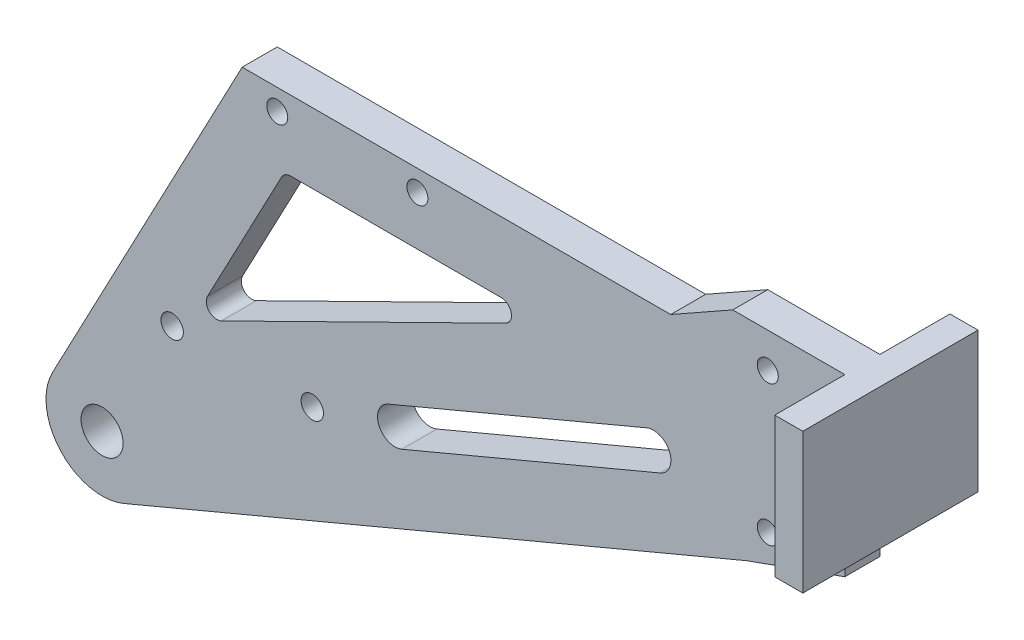
ISO-10303-21;
HEADER;
FILE_DESCRIPTION(('STEP AP214'),'2;1');
FILE_NAME('part.step','',(''),(''),'','','');
FILE_SCHEMA(('AUTOMOTIVE_DESIGN { 1 0 10303 214 1 1 1 1 }'));
ENDSEC;
DATA;
#1=APPLICATION_CONTEXT('core data for automotive mechanical design processes');
#2=APPLICATION_PROTOCOL_DEFINITION('international standard','automotive_design',2000,#1);
#3=PRODUCT_CONTEXT('',#1,'mechanical');
#4=PRODUCT('Part','Part','',(#3));
#5=PRODUCT_RELATED_PRODUCT_CATEGORY('part','',(#4));
#6=PRODUCT_DEFINITION_FORMATION('','',#4);
#7=PRODUCT_DEFINITION_CONTEXT('part definition',#1,'design');
#8=PRODUCT_DEFINITION('design','',#6,#7);
#9=PRODUCT_DEFINITION_SHAPE('','',#8);
#10=(LENGTH_UNIT() NAMED_UNIT(*) SI_UNIT(.MILLI.,.METRE.));
#11=(NAMED_UNIT(*) PLANE_ANGLE_UNIT() SI_UNIT($,.RADIAN.));
#12=(NAMED_UNIT(*) SI_UNIT($,.STERADIAN.) SOLID_ANGLE_UNIT());
#13=UNCERTAINTY_MEASURE_WITH_UNIT(LENGTH_MEASURE(1.E-05),#10,'distance_accuracy_value','');
#14=(GEOMETRIC_REPRESENTATION_CONTEXT(3) GLOBAL_UNCERTAINTY_ASSIGNED_CONTEXT((#13)) GLOBAL_UNIT_ASSIGNED_CONTEXT((#10,
#11,#12)) REPRESENTATION_CONTEXT('',''));
#15=CARTESIAN_POINT('',(0.,0.,0.));
#16=DIRECTION('',(0.,0.,1.));
#17=DIRECTION('',(1.,0.,0.));
#18=AXIS2_PLACEMENT_3D('',#15,#16,#17);
#19=CARTESIAN_POINT('',(0.,0.,5.));
#20=DIRECTION('',(0.,0.,1.));
#21=DIRECTION('',(1.,0.,0.));
#22=AXIS2_PLACEMENT_3D('',#19,#20,#21);
#23=PLANE('',#22);
#24=DIRECTION('',(0.921845226411098,0.387558226003619,0.));
#25=VECTOR('',#24,1.);
#26=CARTESIAN_POINT('',(-0.422501708110136,1.00496172352752,5.));
#27=LINE('',#26,#25);
#28=CARTESIAN_POINT('',(42.7745902769905,19.1656983185825,5.));
#29=VERTEX_POINT('',#28);
#30=CARTESIAN_POINT('',(79.6483993334344,34.6680273587272,5.));
#31=VERTEX_POINT('',#30);
#32=EDGE_CURVE('E58',#29,#31,#27,.T.);
#33=ORIENTED_EDGE('',*,*,#32,.F.);
#34=CARTESIAN_POINT('',(41.8056947119814,21.4703113846102,5.));
#35=DIRECTION('',(0.,0.,1.));
#36=DIRECTION('',(1.,0.,0.));
#37=AXIS2_PLACEMENT_3D('',#34,#35,#36);
#38=CIRCLE('',#37,2.5);
#39=CARTESIAN_POINT('',(40.8367991469724,23.774924450638,5.));
#40=VERTEX_POINT('',#39);
#41=EDGE_CURVE('E403',#40,#29,#38,.T.);
#42=ORIENTED_EDGE('',*,*,#41,.F.);
#43=DIRECTION('',(0.921845226411098,0.387558226003619,0.));
#44=VECTOR('',#43,1.);
#45=CARTESIAN_POINT('',(-2.36029283812824,5.61418785558302,5.));
#46=LINE('',#45,#44);
#47=CARTESIAN_POINT('',(77.7106082034163,39.2772534907827,5.));
#48=VERTEX_POINT('',#47);
#49=EDGE_CURVE('E393',#40,#48,#46,.T.);
#50=ORIENTED_EDGE('',*,*,#49,.T.);
#51=CARTESIAN_POINT('',(78.6795037684253,36.972640424755,5.));
#52=DIRECTION('',(0.,0.,1.));
#53=DIRECTION('',(1.,0.,0.));
#54=AXIS2_PLACEMENT_3D('',#51,#52,#53);
#55=CIRCLE('',#54,2.5);
#56=EDGE_CURVE('E898',#31,#48,#55,.T.);
#57=ORIENTED_EDGE('',*,*,#56,.F.);
#58=EDGE_LOOP('',(#33,#42,#50,#57));
#59=FACE_BOUND('',#58,.T.);
#60=CARTESIAN_POINT('',(10.,18.,5.));
#61=DIRECTION('',(0.,0.,1.));
#62=DIRECTION('',(1.,0.,0.));
#63=AXIS2_PLACEMENT_3D('',#60,#61,#62);
#64=CIRCLE('',#63,1.6);
#65=CARTESIAN_POINT('',(11.6,18.,5.));
#66=VERTEX_POINT('',#65);
#67=EDGE_CURVE('E243',#66,#66,#64,.T.);
#68=ORIENTED_EDGE('',*,*,#67,.F.);
#69=EDGE_LOOP('',(#68));
#70=FACE_BOUND('',#69,.T.);
#71=CARTESIAN_POINT('',(30.,18.,5.));
#72=DIRECTION('',(0.,0.,1.));
#73=DIRECTION('',(1.,0.,0.));
#74=AXIS2_PLACEMENT_3D('',#71,#72,#73);
#75=CIRCLE('',#74,1.6);
#76=CARTESIAN_POINT('',(31.6,18.,5.));
#77=VERTEX_POINT('',#76);
#78=EDGE_CURVE('E238',#77,#77,#75,.T.);
#79=ORIENTED_EDGE('',*,*,#78,.F.);
#80=EDGE_LOOP('',(#79));
#81=FACE_BOUND('',#80,.T.);
#82=CARTESIAN_POINT('',(56.9317860296705,43.5,5.));
#83=DIRECTION('',(0.,0.,1.));
#84=DIRECTION('',(1.,0.,0.));
#85=AXIS2_PLACEMENT_3D('',#82,#83,#84);
#86=CIRCLE('',#85,1.50000000000001);
#87=CARTESIAN_POINT('',(57.5951320607567,42.1546479854543,5.));
#88=VERTEX_POINT('',#87);
#89=CARTESIAN_POINT('',(56.9317860296705,45.,5.));
#90=VERTEX_POINT('',#89);
#91=EDGE_CURVE('E242',#88,#90,#86,.T.);
#92=ORIENTED_EDGE('',*,*,#91,.F.);
#93=DIRECTION('',(0.896901343030464,0.442230687390812,0.));
#94=VECTOR('',#93,1.);
#95=CARTESIAN_POINT('',(17.0325312009098,22.1546479854543,5.));
#96=LINE('',#95,#94);
#97=CARTESIAN_POINT('',(17.0325312009098,22.1546479854543,5.));
#98=VERTEX_POINT('',#97);
#99=EDGE_CURVE('E255',#98,#88,#96,.T.);
#100=ORIENTED_EDGE('',*,*,#99,.F.);
#101=CARTESIAN_POINT('',(16.3691851698236,23.5,5.));
#102=DIRECTION('',(0.,0.,1.));
#103=DIRECTION('',(1.,0.,0.));
#104=AXIS2_PLACEMENT_3D('',#101,#102,#103);
#105=CIRCLE('',#104,1.5);
#106=CARTESIAN_POINT('',(15.0428009644484,24.2005033474091,5.));
#107=VERTEX_POINT('',#106);
#108=EDGE_CURVE('E281',#107,#98,#105,.T.);
#109=ORIENTED_EDGE('',*,*,#108,.F.);
#110=DIRECTION('',(-0.46700223160609,-0.884256136916748,0.));
#111=VECTOR('',#110,1.);
#112=CARTESIAN_POINT('',(25.6054018242954,44.2005033474091,5.));
#113=LINE('',#112,#111);
#114=CARTESIAN_POINT('',(25.6054018242954,44.2005033474091,5.));
#115=VERTEX_POINT('',#114);
#116=EDGE_CURVE('E278',#115,#107,#113,.T.);
#117=ORIENTED_EDGE('',*,*,#116,.F.);
#118=CARTESIAN_POINT('',(26.9317860296705,43.5,5.));
#119=DIRECTION('',(0.,0.,1.));
#120=DIRECTION('',(-1.,0.,0.));
#121=AXIS2_PLACEMENT_3D('',#118,#119,#120);
#122=CIRCLE('',#121,1.5);
#123=CARTESIAN_POINT('',(26.9317860296705,45.,5.));
#124=VERTEX_POINT('',#123);
#125=EDGE_CURVE('E275',#124,#115,#122,.T.);
#126=ORIENTED_EDGE('',*,*,#125,.F.);
#127=DIRECTION('',(-1.,0.,0.));
#128=VECTOR('',#127,1.);
#129=CARTESIAN_POINT('',(56.9317860296705,45.,5.));
#130=LINE('',#129,#128);
#131=EDGE_CURVE('E272',#90,#124,#130,.T.);
#132=ORIENTED_EDGE('',*,*,#131,.F.);
#133=EDGE_LOOP('',(#92,#100,#109,#117,#126,#132));
#134=FACE_BOUND('',#133,.T.);
#135=CARTESIAN_POINT('',(25.,52.,5.));
#136=DIRECTION('',(0.,0.,1.));
#137=DIRECTION('',(1.,0.,0.));
#138=AXIS2_PLACEMENT_3D('',#135,#136,#137);
#139=CIRCLE('',#138,1.5);
#140=CARTESIAN_POINT('',(26.5,52.,5.));
#141=VERTEX_POINT('',#140);
#142=EDGE_CURVE('E310',#141,#141,#139,.T.);
#143=ORIENTED_EDGE('',*,*,#142,.F.);
#144=EDGE_LOOP('',(#143));
#145=FACE_BOUND('',#144,.T.);
#146=CARTESIAN_POINT('',(45.,52.,5.));
#147=DIRECTION('',(0.,0.,1.));
#148=DIRECTION('',(1.,0.,0.));
#149=AXIS2_PLACEMENT_3D('',#146,#147,#148);
#150=CIRCLE('',#149,1.5);
#151=CARTESIAN_POINT('',(46.5,52.,5.));
#152=VERTEX_POINT('',#151);
#153=EDGE_CURVE('E301',#152,#152,#150,.T.);
#154=ORIENTED_EDGE('',*,*,#153,.F.);
#155=EDGE_LOOP('',(#154));
#156=FACE_BOUND('',#155,.T.);
#157=CARTESIAN_POINT('',(0.,0.,5.));
#158=DIRECTION('',(0.,0.,1.));
#159=DIRECTION('',(1.,0.,0.));
#160=AXIS2_PLACEMENT_3D('',#157,#158,#159);
#161=CIRCLE('',#160,3.);
#162=CARTESIAN_POINT('',(3.,0.,5.));
#163=VERTEX_POINT('',#162);
#164=EDGE_CURVE('E341',#163,#163,#161,.T.);
#165=ORIENTED_EDGE('',*,*,#164,.F.);
#166=EDGE_LOOP('',(#165));
#167=FACE_BOUND('',#166,.T.);
#168=CARTESIAN_POINT('',(95.,55.,5.));
#169=DIRECTION('',(0.,0.,1.));
#170=DIRECTION('',(1.,0.,0.));
#171=AXIS2_PLACEMENT_3D('',#168,#169,#170);
#172=CIRCLE('',#171,1.5);
#173=CARTESIAN_POINT('',(96.5,55.,5.));
#174=VERTEX_POINT('',#173);
#175=EDGE_CURVE('E335',#174,#174,#172,.T.);
#176=ORIENTED_EDGE('',*,*,#175,.F.);
#177=EDGE_LOOP('',(#176));
#178=FACE_BOUND('',#177,.T.);
#179=CARTESIAN_POINT('',(95.,35.,5.));
#180=DIRECTION('',(0.,0.,1.));
#181=DIRECTION('',(1.,0.,0.));
#182=AXIS2_PLACEMENT_3D('',#179,#180,#181);
#183=CIRCLE('',#182,1.5);
#184=CARTESIAN_POINT('',(96.5,35.,5.));
#185=VERTEX_POINT('',#184);
#186=EDGE_CURVE('E329',#185,#185,#183,.T.);
#187=ORIENTED_EDGE('',*,*,#186,.F.);
#188=EDGE_LOOP('',(#187));
#189=FACE_BOUND('',#188,.T.);
#190=DIRECTION('',(0.921845226411098,0.387558226003619,0.));
#191=VECTOR('',#190,1.);
#192=CARTESIAN_POINT('',(92.,30.,5.));
#193=LINE('',#192,#191);
#194=CARTESIAN_POINT('',(3.10046580802895,-7.37476181128878,5.));
#195=VERTEX_POINT('',#194);
#196=CARTESIAN_POINT('',(92.,30.,5.));
#197=VERTEX_POINT('',#196);
#198=EDGE_CURVE('E349',#195,#197,#193,.T.);
#199=ORIENTED_EDGE('',*,*,#198,.T.);
#200=DIRECTION('',(0.941401777857667,0.337287255386894,0.));
#201=VECTOR('',#200,1.);
#202=CARTESIAN_POINT('',(0.940483067372337,-2.62498039142855,5.));
#203=LINE('',#202,#201);
#204=CARTESIAN_POINT('',(106.,35.0159471614366,5.));
#205=VERTEX_POINT('',#204);
#206=EDGE_CURVE('E396',#197,#205,#203,.T.);
#207=ORIENTED_EDGE('',*,*,#206,.T.);
#208=DIRECTION('',(0.,-1.,0.));
#209=VECTOR('',#208,1.);
#210=CARTESIAN_POINT('',(106.,0.,5.));
#211=LINE('',#210,#209);
#212=CARTESIAN_POINT('',(106.,40.,5.));
#213=VERTEX_POINT('',#212);
#214=EDGE_CURVE('E439',#213,#205,#211,.T.);
#215=ORIENTED_EDGE('',*,*,#214,.F.);
#216=DIRECTION('',(0.,-1.,0.));
#217=VECTOR('',#216,1.);
#218=CARTESIAN_POINT('',(106.,0.,5.));
#219=LINE('',#218,#217);
#220=CARTESIAN_POINT('',(106.,60.,5.));
#221=VERTEX_POINT('',#220);
#222=EDGE_CURVE('E235',#221,#213,#219,.T.);
#223=ORIENTED_EDGE('',*,*,#222,.F.);
#224=DIRECTION('',(-1.,0.,0.));
#225=VECTOR('',#224,1.);
#226=CARTESIAN_POINT('',(90.,60.,5.));
#227=LINE('',#226,#225);
#228=CARTESIAN_POINT('',(90.,60.,5.));
#229=VERTEX_POINT('',#228);
#230=EDGE_CURVE('E353',#221,#229,#227,.T.);
#231=ORIENTED_EDGE('',*,*,#230,.T.);
#232=DIRECTION('',(-0.870797121650983,-0.4916425255451,0.));
#233=VECTOR('',#232,1.);
#234=CARTESIAN_POINT('',(-3.9331402043608,6.96637697320786,5.));
#235=LINE('',#234,#233);
#236=CARTESIAN_POINT('',(81.1440012162749,55.,5.));
#237=VERTEX_POINT('',#236);
#238=EDGE_CURVE('E355',#229,#237,#235,.T.);
#239=ORIENTED_EDGE('',*,*,#238,.T.);
#240=DIRECTION('',(-1.,0.,0.));
#241=VECTOR('',#240,1.);
#242=CARTESIAN_POINT('',(81.1440012162749,55.,5.));
#243=LINE('',#242,#241);
#244=CARTESIAN_POINT('',(20.,55.,5.));
#245=VERTEX_POINT('',#244);
#246=EDGE_CURVE('E309',#237,#245,#243,.T.);
#247=ORIENTED_EDGE('',*,*,#246,.T.);
#248=DIRECTION('',(-0.46700223160609,-0.884256136916748,0.));
#249=VECTOR('',#248,1.);
#250=CARTESIAN_POINT('',(-7.07404909533399,3.73601785284872,5.));
#251=LINE('',#250,#249);
#252=CARTESIAN_POINT('',(-7.07404909533399,3.73601785284872,5.));
#253=VERTEX_POINT('',#252);
#254=EDGE_CURVE('E288',#245,#253,#251,.T.);
#255=ORIENTED_EDGE('',*,*,#254,.T.);
#256=CARTESIAN_POINT('',(0.,0.,5.));
#257=DIRECTION('',(0.,0.,1.));
#258=DIRECTION('',(1.,0.,0.));
#259=AXIS2_PLACEMENT_3D('',#256,#257,#258);
#260=CIRCLE('',#259,8.);
#261=EDGE_CURVE('E347',#253,#195,#260,.T.);
#262=ORIENTED_EDGE('',*,*,#261,.T.);
#263=EDGE_LOOP('',(#199,#207,#215,#223,#231,#239,#247,#255,#262));
#264=FACE_BOUND('',#263,.T.);
#265=ADVANCED_FACE('F43',(#59,#70,#81,#134,#145,#156,#167,#178,#189,#264),#23,.T.);
#266=CARTESIAN_POINT('',(0.,0.,0.));
#267=DIRECTION('',(0.,0.,1.));
#268=DIRECTION('',(1.,0.,0.));
#269=AXIS2_PLACEMENT_3D('',#266,#267,#268);
#270=PLANE('',#269);
#271=CARTESIAN_POINT('',(41.8056947119814,21.4703113846102,0.));
#272=DIRECTION('',(0.,0.,1.));
#273=DIRECTION('',(1.,0.,0.));
#274=AXIS2_PLACEMENT_3D('',#271,#272,#273);
#275=CIRCLE('',#274,2.5);
#276=CARTESIAN_POINT('',(40.8367991469724,23.774924450638,0.));
#277=VERTEX_POINT('',#276);
#278=CARTESIAN_POINT('',(42.7745902769905,19.1656983185825,0.));
#279=VERTEX_POINT('',#278);
#280=EDGE_CURVE('E51',#277,#279,#275,.T.);
#281=ORIENTED_EDGE('',*,*,#280,.T.);
#282=DIRECTION('',(0.921845226411098,0.387558226003619,0.));
#283=VECTOR('',#282,1.);
#284=CARTESIAN_POINT('',(-0.422501708110136,1.00496172352752,0.));
#285=LINE('',#284,#283);
#286=CARTESIAN_POINT('',(79.6483993334344,34.6680273587272,0.));
#287=VERTEX_POINT('',#286);
#288=EDGE_CURVE('E11',#279,#287,#285,.T.);
#289=ORIENTED_EDGE('',*,*,#288,.T.);
#290=CARTESIAN_POINT('',(78.6795037684253,36.972640424755,0.));
#291=DIRECTION('',(0.,0.,1.));
#292=DIRECTION('',(1.,0.,0.));
#293=AXIS2_PLACEMENT_3D('',#290,#291,#292);
#294=CIRCLE('',#293,2.5);
#295=CARTESIAN_POINT('',(77.7106082034163,39.2772534907827,0.));
#296=VERTEX_POINT('',#295);
#297=EDGE_CURVE('E373',#287,#296,#294,.T.);
#298=ORIENTED_EDGE('',*,*,#297,.T.);
#299=DIRECTION('',(0.921845226411098,0.387558226003619,0.));
#300=VECTOR('',#299,1.);
#301=CARTESIAN_POINT('',(-2.36029283812824,5.61418785558302,0.));
#302=LINE('',#301,#300);
#303=EDGE_CURVE('E376',#277,#296,#302,.T.);
#304=ORIENTED_EDGE('',*,*,#303,.F.);
#305=EDGE_LOOP('',(#281,#289,#298,#304));
#306=FACE_BOUND('',#305,.T.);
#307=CARTESIAN_POINT('',(95.,35.,0.));
#308=DIRECTION('',(0.,0.,1.));
#309=DIRECTION('',(1.,0.,0.));
#310=AXIS2_PLACEMENT_3D('',#307,#308,#309);
#311=CIRCLE('',#310,1.5);
#312=CARTESIAN_POINT('',(96.5,35.,0.));
#313=VERTEX_POINT('',#312);
#314=EDGE_CURVE('E328',#313,#313,#311,.T.);
#315=ORIENTED_EDGE('',*,*,#314,.T.);
#316=EDGE_LOOP('',(#315));
#317=FACE_BOUND('',#316,.T.);
#318=CARTESIAN_POINT('',(95.,55.,0.));
#319=DIRECTION('',(0.,0.,1.));
#320=DIRECTION('',(1.,0.,0.));
#321=AXIS2_PLACEMENT_3D('',#318,#319,#320);
#322=CIRCLE('',#321,1.5);
#323=CARTESIAN_POINT('',(96.5,55.,0.));
#324=VERTEX_POINT('',#323);
#325=EDGE_CURVE('E332',#324,#324,#322,.T.);
#326=ORIENTED_EDGE('',*,*,#325,.T.);
#327=EDGE_LOOP('',(#326));
#328=FACE_BOUND('',#327,.T.);
#329=CARTESIAN_POINT('',(0.,0.,0.));
#330=DIRECTION('',(0.,0.,1.));
#331=DIRECTION('',(1.,0.,0.));
#332=AXIS2_PLACEMENT_3D('',#329,#330,#331);
#333=CIRCLE('',#332,3.);
#334=CARTESIAN_POINT('',(3.,0.,0.));
#335=VERTEX_POINT('',#334);
#336=EDGE_CURVE('E338',#335,#335,#333,.T.);
#337=ORIENTED_EDGE('',*,*,#336,.T.);
#338=EDGE_LOOP('',(#337));
#339=FACE_BOUND('',#338,.T.);
#340=CARTESIAN_POINT('',(45.,52.,0.));
#341=DIRECTION('',(0.,0.,1.));
#342=DIRECTION('',(1.,0.,0.));
#343=AXIS2_PLACEMENT_3D('',#340,#341,#342);
#344=CIRCLE('',#343,1.5);
#345=CARTESIAN_POINT('',(46.5,52.,0.));
#346=VERTEX_POINT('',#345);
#347=EDGE_CURVE('E313',#346,#346,#344,.T.);
#348=ORIENTED_EDGE('',*,*,#347,.T.);
#349=EDGE_LOOP('',(#348));
#350=FACE_BOUND('',#349,.T.);
#351=CARTESIAN_POINT('',(25.,52.,0.));
#352=DIRECTION('',(0.,0.,1.));
#353=DIRECTION('',(1.,0.,0.));
#354=AXIS2_PLACEMENT_3D('',#351,#352,#353);
#355=CIRCLE('',#354,1.5);
#356=CARTESIAN_POINT('',(26.5,52.,0.));
#357=VERTEX_POINT('',#356);
#358=EDGE_CURVE('E306',#357,#357,#355,.T.);
#359=ORIENTED_EDGE('',*,*,#358,.T.);
#360=EDGE_LOOP('',(#359));
#361=FACE_BOUND('',#360,.T.);
#362=DIRECTION('',(0.896901343030464,0.442230687390812,0.));
#363=VECTOR('',#362,1.);
#364=CARTESIAN_POINT('',(17.0325312009098,22.1546479854543,0.));
#365=LINE('',#364,#363);
#366=CARTESIAN_POINT('',(17.0325312009098,22.1546479854543,0.));
#367=VERTEX_POINT('',#366);
#368=CARTESIAN_POINT('',(57.5951320607567,42.1546479854543,0.));
#369=VERTEX_POINT('',#368);
#370=EDGE_CURVE('E267',#367,#369,#365,.T.);
#371=ORIENTED_EDGE('',*,*,#370,.T.);
#372=CARTESIAN_POINT('',(56.9317860296705,43.5,0.));
#373=DIRECTION('',(0.,0.,1.));
#374=DIRECTION('',(1.,0.,0.));
#375=AXIS2_PLACEMENT_3D('',#372,#373,#374);
#376=CIRCLE('',#375,1.50000000000001);
#377=CARTESIAN_POINT('',(56.9317860296705,45.,0.));
#378=VERTEX_POINT('',#377);
#379=EDGE_CURVE('E251',#369,#378,#376,.T.);
#380=ORIENTED_EDGE('',*,*,#379,.T.);
#381=DIRECTION('',(-1.,0.,0.));
#382=VECTOR('',#381,1.);
#383=CARTESIAN_POINT('',(56.9317860296705,45.,0.));
#384=LINE('',#383,#382);
#385=CARTESIAN_POINT('',(26.9317860296705,45.,0.));
#386=VERTEX_POINT('',#385);
#387=EDGE_CURVE('E254',#378,#386,#384,.T.);
#388=ORIENTED_EDGE('',*,*,#387,.T.);
#389=CARTESIAN_POINT('',(26.9317860296705,43.5,0.));
#390=DIRECTION('',(0.,0.,1.));
#391=DIRECTION('',(-1.,0.,0.));
#392=AXIS2_PLACEMENT_3D('',#389,#390,#391);
#393=CIRCLE('',#392,1.5);
#394=CARTESIAN_POINT('',(25.6054018242954,44.2005033474091,0.));
#395=VERTEX_POINT('',#394);
#396=EDGE_CURVE('E258',#386,#395,#393,.T.);
#397=ORIENTED_EDGE('',*,*,#396,.T.);
#398=DIRECTION('',(-0.46700223160609,-0.884256136916748,0.));
#399=VECTOR('',#398,1.);
#400=CARTESIAN_POINT('',(25.6054018242954,44.2005033474091,0.));
#401=LINE('',#400,#399);
#402=CARTESIAN_POINT('',(15.0428009644484,24.2005033474091,0.));
#403=VERTEX_POINT('',#402);
#404=EDGE_CURVE('E261',#395,#403,#401,.T.);
#405=ORIENTED_EDGE('',*,*,#404,.T.);
#406=CARTESIAN_POINT('',(16.3691851698236,23.5,0.));
#407=DIRECTION('',(0.,0.,1.));
#408=DIRECTION('',(1.,0.,0.));
#409=AXIS2_PLACEMENT_3D('',#406,#407,#408);
#410=CIRCLE('',#409,1.5);
#411=EDGE_CURVE('E264',#403,#367,#410,.T.);
#412=ORIENTED_EDGE('',*,*,#411,.T.);
#413=EDGE_LOOP('',(#371,#380,#388,#397,#405,#412));
#414=FACE_BOUND('',#413,.T.);
#415=CARTESIAN_POINT('',(30.,18.,0.));
#416=DIRECTION('',(0.,0.,1.));
#417=DIRECTION('',(1.,0.,0.));
#418=AXIS2_PLACEMENT_3D('',#415,#416,#417);
#419=CIRCLE('',#418,1.6);
#420=CARTESIAN_POINT('',(31.6,18.,0.));
#421=VERTEX_POINT('',#420);
#422=EDGE_CURVE('E246',#421,#421,#419,.T.);
#423=ORIENTED_EDGE('',*,*,#422,.T.);
#424=EDGE_LOOP('',(#423));
#425=FACE_BOUND('',#424,.T.);
#426=CARTESIAN_POINT('',(10.,18.,0.));
#427=DIRECTION('',(0.,0.,1.));
#428=DIRECTION('',(1.,0.,0.));
#429=AXIS2_PLACEMENT_3D('',#426,#427,#428);
#430=CIRCLE('',#429,1.6);
#431=CARTESIAN_POINT('',(11.6,18.,0.));
#432=VERTEX_POINT('',#431);
#433=EDGE_CURVE('E239',#432,#432,#430,.T.);
#434=ORIENTED_EDGE('',*,*,#433,.T.);
#435=EDGE_LOOP('',(#434));
#436=FACE_BOUND('',#435,.T.);
#437=DIRECTION('',(0.941401777857667,0.337287255386894,0.));
#438=VECTOR('',#437,1.);
#439=CARTESIAN_POINT('',(0.940483067372337,-2.62498039142855,0.));
#440=LINE('',#439,#438);
#441=CARTESIAN_POINT('',(92.,30.,0.));
#442=VERTEX_POINT('',#441);
#443=CARTESIAN_POINT('',(106.,35.0159471614366,0.));
#444=VERTEX_POINT('',#443);
#445=EDGE_CURVE('E406',#442,#444,#440,.T.);
#446=ORIENTED_EDGE('',*,*,#445,.F.);
#447=DIRECTION('',(0.921845226411098,0.387558226003619,0.));
#448=VECTOR('',#447,1.);
#449=CARTESIAN_POINT('',(92.,30.,0.));
#450=LINE('',#449,#448);
#451=CARTESIAN_POINT('',(3.10046580802895,-7.37476181128878,0.));
#452=VERTEX_POINT('',#451);
#453=EDGE_CURVE('E360',#452,#442,#450,.T.);
#454=ORIENTED_EDGE('',*,*,#453,.F.);
#455=CARTESIAN_POINT('',(0.,0.,0.));
#456=DIRECTION('',(0.,0.,1.));
#457=DIRECTION('',(1.,0.,0.));
#458=AXIS2_PLACEMENT_3D('',#455,#456,#457);
#459=CIRCLE('',#458,8.);
#460=CARTESIAN_POINT('',(-7.07404909533399,3.73601785284872,0.));
#461=VERTEX_POINT('',#460);
#462=EDGE_CURVE('E344',#461,#452,#459,.T.);
#463=ORIENTED_EDGE('',*,*,#462,.F.);
#464=DIRECTION('',(0.46700223160609,0.884256136916749,0.));
#465=VECTOR('',#464,1.);
#466=CARTESIAN_POINT('',(-7.07404909533399,3.73601785284872,0.));
#467=LINE('',#466,#465);
#468=CARTESIAN_POINT('',(20.,55.,0.));
#469=VERTEX_POINT('',#468);
#470=EDGE_CURVE('E299',#461,#469,#467,.T.);
#471=ORIENTED_EDGE('',*,*,#470,.T.);
#472=DIRECTION('',(1.,0.,0.));
#473=VECTOR('',#472,1.);
#474=CARTESIAN_POINT('',(81.1440012162749,55.,0.));
#475=LINE('',#474,#473);
#476=CARTESIAN_POINT('',(81.1440012162749,55.,0.));
#477=VERTEX_POINT('',#476);
#478=EDGE_CURVE('E324',#469,#477,#475,.T.);
#479=ORIENTED_EDGE('',*,*,#478,.T.);
#480=DIRECTION('',(-0.870797121650983,-0.4916425255451,0.));
#481=VECTOR('',#480,1.);
#482=CARTESIAN_POINT('',(-3.9331402043608,6.96637697320786,0.));
#483=LINE('',#482,#481);
#484=CARTESIAN_POINT('',(90.,60.,0.));
#485=VERTEX_POINT('',#484);
#486=EDGE_CURVE('E350',#485,#477,#483,.T.);
#487=ORIENTED_EDGE('',*,*,#486,.F.);
#488=DIRECTION('',(-1.,0.,0.));
#489=VECTOR('',#488,1.);
#490=CARTESIAN_POINT('',(90.,60.,0.));
#491=LINE('',#490,#489);
#492=CARTESIAN_POINT('',(106.,60.,0.));
#493=VERTEX_POINT('',#492);
#494=EDGE_CURVE('E363',#493,#485,#491,.T.);
#495=ORIENTED_EDGE('',*,*,#494,.F.);
#496=DIRECTION('',(0.,-1.,0.));
#497=VECTOR('',#496,1.);
#498=CARTESIAN_POINT('',(106.,0.,0.));
#499=LINE('',#498,#497);
#500=CARTESIAN_POINT('',(106.,40.,0.));
#501=VERTEX_POINT('',#500);
#502=EDGE_CURVE('E227',#493,#501,#499,.T.);
#503=ORIENTED_EDGE('',*,*,#502,.T.);
#504=DIRECTION('',(0.,-1.,0.));
#505=VECTOR('',#504,1.);
#506=CARTESIAN_POINT('',(106.,0.,0.));
#507=LINE('',#506,#505);
#508=EDGE_CURVE('E436',#501,#444,#507,.T.);
#509=ORIENTED_EDGE('',*,*,#508,.T.);
#510=EDGE_LOOP('',(#446,#454,#463,#471,#479,#487,#495,#503,#509));
#511=FACE_BOUND('',#510,.T.);
#512=ADVANCED_FACE('F380',(#306,#317,#328,#339,#350,#361,#414,#425,#436,#511),#270,.F.);
#513=CARTESIAN_POINT('',(106.,60.,-10.));
#514=DIRECTION('',(0.,0.,-1.));
#515=DIRECTION('',(-1.,0.,0.));
#516=AXIS2_PLACEMENT_3D('',#513,#514,#515);
#517=PLANE('',#516);
#518=DIRECTION('',(-1.,0.,0.));
#519=VECTOR('',#518,1.);
#520=CARTESIAN_POINT('',(0.,40.,-10.));
#521=LINE('',#520,#519);
#522=CARTESIAN_POINT('',(110.,40.,-10.));
#523=VERTEX_POINT('',#522);
#524=CARTESIAN_POINT('',(106.,40.,-10.));
#525=VERTEX_POINT('',#524);
#526=EDGE_CURVE('E209',#523,#525,#521,.T.);
#527=ORIENTED_EDGE('',*,*,#526,.T.);
#528=DIRECTION('',(0.,1.,0.));
#529=VECTOR('',#528,1.);
#530=CARTESIAN_POINT('',(106.,60.,-10.));
#531=LINE('',#530,#529);
#532=CARTESIAN_POINT('',(106.,60.,-10.));
#533=VERTEX_POINT('',#532);
#534=EDGE_CURVE('E224',#525,#533,#531,.T.);
#535=ORIENTED_EDGE('',*,*,#534,.T.);
#536=DIRECTION('',(1.,0.,0.));
#537=VECTOR('',#536,1.);
#538=CARTESIAN_POINT('',(106.,60.,-10.));
#539=LINE('',#538,#537);
#540=CARTESIAN_POINT('',(110.,60.,-10.));
#541=VERTEX_POINT('',#540);
#542=EDGE_CURVE('E217',#533,#541,#539,.T.);
#543=ORIENTED_EDGE('',*,*,#542,.T.);
#544=DIRECTION('',(0.,-1.,0.));
#545=VECTOR('',#544,1.);
#546=CARTESIAN_POINT('',(110.,0.,-10.));
#547=LINE('',#546,#545);
#548=EDGE_CURVE('E198',#541,#523,#547,.T.);
#549=ORIENTED_EDGE('',*,*,#548,.T.);
#550=EDGE_LOOP('',(#527,#535,#543,#549));
#551=FACE_BOUND('',#550,.T.);
#552=ADVANCED_FACE('F222',(#551),#517,.T.);
#553=CARTESIAN_POINT('',(106.,0.,0.));
#554=DIRECTION('',(-1.,0.,0.));
#555=DIRECTION('',(0.,-1.,0.));
#556=AXIS2_PLACEMENT_3D('',#553,#554,#555);
#557=PLANE('',#556);
#558=DIRECTION('',(0.,0.,1.));
#559=VECTOR('',#558,1.);
#560=CARTESIAN_POINT('',(106.,40.,-10.));
#561=LINE('',#560,#559);
#562=EDGE_CURVE('E429',#525,#501,#561,.T.);
#563=ORIENTED_EDGE('',*,*,#562,.T.);
#564=ORIENTED_EDGE('',*,*,#502,.F.);
#565=DIRECTION('',(0.,0.,1.));
#566=VECTOR('',#565,1.);
#567=CARTESIAN_POINT('',(106.,60.,15.));
#568=LINE('',#567,#566);
#569=EDGE_CURVE('E230',#533,#493,#568,.T.);
#570=ORIENTED_EDGE('',*,*,#569,.F.);
#571=ORIENTED_EDGE('',*,*,#534,.F.);
#572=EDGE_LOOP('',(#563,#564,#570,#571));
#573=FACE_BOUND('',#572,.T.);
#574=ADVANCED_FACE('F444',(#573),#557,.T.);
#575=CARTESIAN_POINT('',(106.,30.,15.));
#576=DIRECTION('',(0.,0.,1.));
#577=DIRECTION('',(1.,0.,0.));
#578=AXIS2_PLACEMENT_3D('',#575,#576,#577);
#579=PLANE('',#578);
#580=DIRECTION('',(-1.,0.,0.));
#581=VECTOR('',#580,1.);
#582=CARTESIAN_POINT('',(0.,40.,15.));
#583=LINE('',#582,#581);
#584=CARTESIAN_POINT('',(110.,40.,15.));
#585=VERTEX_POINT('',#584);
#586=CARTESIAN_POINT('',(106.,40.,15.));
#587=VERTEX_POINT('',#586);
#588=EDGE_CURVE('E210',#585,#587,#583,.T.);
#589=ORIENTED_EDGE('',*,*,#588,.F.);
#590=DIRECTION('',(0.,-1.,0.));
#591=VECTOR('',#590,1.);
#592=CARTESIAN_POINT('',(110.,0.,15.));
#593=LINE('',#592,#591);
#594=CARTESIAN_POINT('',(110.,60.,15.));
#595=VERTEX_POINT('',#594);
#596=EDGE_CURVE('E420',#595,#585,#593,.T.);
#597=ORIENTED_EDGE('',*,*,#596,.F.);
#598=DIRECTION('',(1.,0.,0.));
#599=VECTOR('',#598,1.);
#600=CARTESIAN_POINT('',(106.,60.,15.));
#601=LINE('',#600,#599);
#602=CARTESIAN_POINT('',(106.,60.,15.));
#603=VERTEX_POINT('',#602);
#604=EDGE_CURVE('E220',#603,#595,#601,.T.);
#605=ORIENTED_EDGE('',*,*,#604,.F.);
#606=DIRECTION('',(0.,-1.,0.));
#607=VECTOR('',#606,1.);
#608=CARTESIAN_POINT('',(106.,30.,15.));
#609=LINE('',#608,#607);
#610=EDGE_CURVE('E225',#603,#587,#609,.T.);
#611=ORIENTED_EDGE('',*,*,#610,.T.);
#612=EDGE_LOOP('',(#589,#597,#605,#611));
#613=FACE_BOUND('',#612,.T.);
#614=ADVANCED_FACE('F419',(#613),#579,.T.);
#615=EDGE_CURVE('E423',#213,#587,#561,.T.);
#616=ORIENTED_EDGE('',*,*,#615,.T.);
#617=ORIENTED_EDGE('',*,*,#610,.F.);
#618=EDGE_CURVE('E410',#221,#603,#568,.T.);
#619=ORIENTED_EDGE('',*,*,#618,.F.);
#620=ORIENTED_EDGE('',*,*,#222,.T.);
#621=EDGE_LOOP('',(#616,#617,#619,#620));
#622=FACE_BOUND('',#621,.T.);
#623=ADVANCED_FACE('F422',(#622),#557,.T.);
#624=CARTESIAN_POINT('',(0.,0.,5.));
#625=DIRECTION('',(0.,0.,-1.));
#626=DIRECTION('',(-1.,0.,0.));
#627=AXIS2_PLACEMENT_3D('',#624,#625,#626);
#628=CYLINDRICAL_SURFACE('',#627,8.);
#629=ORIENTED_EDGE('',*,*,#261,.F.);
#630=DIRECTION('',(0.,0.,1.));
#631=VECTOR('',#630,1.);
#632=CARTESIAN_POINT('',(-7.07404909533399,3.73601785284872,-57.974132162543));
#633=LINE('',#632,#631);
#634=EDGE_CURVE('E302',#461,#253,#633,.T.);
#635=ORIENTED_EDGE('',*,*,#634,.F.);
#636=ORIENTED_EDGE('',*,*,#462,.T.);
#637=DIRECTION('',(0.,0.,-1.));
#638=VECTOR('',#637,1.);
#639=CARTESIAN_POINT('',(3.10046580802895,-7.37476181128878,5.));
#640=LINE('',#639,#638);
#641=EDGE_CURVE('E370',#195,#452,#640,.T.);
#642=ORIENTED_EDGE('',*,*,#641,.F.);
#643=EDGE_LOOP('',(#629,#635,#636,#642));
#644=FACE_BOUND('',#643,.T.);
#645=ADVANCED_FACE('F45',(#644),#628,.T.);
#646=CARTESIAN_POINT('',(92.,30.,5.));
#647=DIRECTION('',(-0.387558226003619,0.921845226411098,0.));
#648=DIRECTION('',(-0.921845226411098,-0.387558226003619,0.));
#649=AXIS2_PLACEMENT_3D('',#646,#647,#648);
#650=PLANE('',#649);
#651=ORIENTED_EDGE('',*,*,#453,.T.);
#652=DIRECTION('',(0.,0.,-1.));
#653=VECTOR('',#652,1.);
#654=CARTESIAN_POINT('',(92.,30.,5.));
#655=LINE('',#654,#653);
#656=EDGE_CURVE('E368',#197,#442,#655,.T.);
#657=ORIENTED_EDGE('',*,*,#656,.F.);
#658=ORIENTED_EDGE('',*,*,#198,.F.);
#659=ORIENTED_EDGE('',*,*,#641,.T.);
#660=EDGE_LOOP('',(#651,#657,#658,#659));
#661=FACE_BOUND('',#660,.T.);
#662=ADVANCED_FACE('F468',(#661),#650,.F.);
#663=CARTESIAN_POINT('',(90.,60.,5.));
#664=DIRECTION('',(0.,-1.,0.));
#665=DIRECTION('',(0.,0.,-1.));
#666=AXIS2_PLACEMENT_3D('',#663,#664,#665);
#667=PLANE('',#666);
#668=ORIENTED_EDGE('',*,*,#604,.T.);
#669=DIRECTION('',(0.,0.,1.));
#670=VECTOR('',#669,1.);
#671=CARTESIAN_POINT('',(110.,60.,-10.));
#672=LINE('',#671,#670);
#673=EDGE_CURVE('E202',#541,#595,#672,.T.);
#674=ORIENTED_EDGE('',*,*,#673,.F.);
#675=ORIENTED_EDGE('',*,*,#542,.F.);
#676=ORIENTED_EDGE('',*,*,#569,.T.);
#677=ORIENTED_EDGE('',*,*,#494,.T.);
#678=DIRECTION('',(0.,0.,-1.));
#679=VECTOR('',#678,1.);
#680=CARTESIAN_POINT('',(90.,60.,5.));
#681=LINE('',#680,#679);
#682=EDGE_CURVE('E358',#229,#485,#681,.T.);
#683=ORIENTED_EDGE('',*,*,#682,.F.);
#684=ORIENTED_EDGE('',*,*,#230,.F.);
#685=ORIENTED_EDGE('',*,*,#618,.T.);
#686=EDGE_LOOP('',(#668,#674,#675,#676,#677,#683,#684,#685));
#687=FACE_BOUND('',#686,.T.);
#688=ADVANCED_FACE('F215',(#687),#667,.F.);
#689=CARTESIAN_POINT('',(-3.9331402043608,6.96637697320786,5.));
#690=DIRECTION('',(0.4916425255451,-0.870797121650983,0.));
#691=DIRECTION('',(0.870797121650983,0.4916425255451,0.));
#692=AXIS2_PLACEMENT_3D('',#689,#690,#691);
#693=PLANE('',#692);
#694=ORIENTED_EDGE('',*,*,#486,.T.);
#695=DIRECTION('',(0.,0.,1.));
#696=VECTOR('',#695,1.);
#697=CARTESIAN_POINT('',(81.1440012162749,55.,-70.2161269209863));
#698=LINE('',#697,#696);
#699=EDGE_CURVE('E320',#477,#237,#698,.T.);
#700=ORIENTED_EDGE('',*,*,#699,.T.);
#701=ORIENTED_EDGE('',*,*,#238,.F.);
#702=ORIENTED_EDGE('',*,*,#682,.T.);
#703=EDGE_LOOP('',(#694,#700,#701,#702));
#704=FACE_BOUND('',#703,.T.);
#705=ADVANCED_FACE('F450',(#704),#693,.F.);
#706=CARTESIAN_POINT('',(0.,0.,5.));
#707=DIRECTION('',(0.,0.,-1.));
#708=DIRECTION('',(-1.,0.,0.));
#709=AXIS2_PLACEMENT_3D('',#706,#707,#708);
#710=CYLINDRICAL_SURFACE('',#709,3.);
#711=ORIENTED_EDGE('',*,*,#164,.T.);
#712=EDGE_LOOP('',(#711));
#713=FACE_BOUND('',#712,.T.);
#714=ORIENTED_EDGE('',*,*,#336,.F.);
#715=EDGE_LOOP('',(#714));
#716=FACE_BOUND('',#715,.T.);
#717=ADVANCED_FACE('F494',(#713,#716),#710,.F.);
#718=CARTESIAN_POINT('',(95.,55.,5.));
#719=DIRECTION('',(0.,0.,-1.));
#720=DIRECTION('',(-1.,0.,0.));
#721=AXIS2_PLACEMENT_3D('',#718,#719,#720);
#722=CYLINDRICAL_SURFACE('',#721,1.5);
#723=ORIENTED_EDGE('',*,*,#175,.T.);
#724=EDGE_LOOP('',(#723));
#725=FACE_BOUND('',#724,.T.);
#726=ORIENTED_EDGE('',*,*,#325,.F.);
#727=EDGE_LOOP('',(#726));
#728=FACE_BOUND('',#727,.T.);
#729=ADVANCED_FACE('F560',(#725,#728),#722,.F.);
#730=CARTESIAN_POINT('',(95.,35.,5.));
#731=DIRECTION('',(0.,0.,-1.));
#732=DIRECTION('',(-1.,0.,0.));
#733=AXIS2_PLACEMENT_3D('',#730,#731,#732);
#734=CYLINDRICAL_SURFACE('',#733,1.5);
#735=ORIENTED_EDGE('',*,*,#186,.T.);
#736=EDGE_LOOP('',(#735));
#737=FACE_BOUND('',#736,.T.);
#738=ORIENTED_EDGE('',*,*,#314,.F.);
#739=EDGE_LOOP('',(#738));
#740=FACE_BOUND('',#739,.T.);
#741=ADVANCED_FACE('F558',(#737,#740),#734,.F.);
#742=CARTESIAN_POINT('',(81.1440012162749,55.,-70.2161269209863));
#743=DIRECTION('',(0.,1.,0.));
#744=DIRECTION('',(-1.,0.,0.));
#745=AXIS2_PLACEMENT_3D('',#742,#743,#744);
#746=PLANE('',#745);
#747=ORIENTED_EDGE('',*,*,#478,.F.);
#748=DIRECTION('',(0.,0.,1.));
#749=VECTOR('',#748,1.);
#750=CARTESIAN_POINT('',(20.,55.,-70.2161269209863));
#751=LINE('',#750,#749);
#752=EDGE_CURVE('E321',#469,#245,#751,.T.);
#753=ORIENTED_EDGE('',*,*,#752,.T.);
#754=ORIENTED_EDGE('',*,*,#246,.F.);
#755=ORIENTED_EDGE('',*,*,#699,.F.);
#756=EDGE_LOOP('',(#747,#753,#754,#755));
#757=FACE_BOUND('',#756,.T.);
#758=ADVANCED_FACE('F456',(#757),#746,.T.);
#759=CARTESIAN_POINT('',(45.,52.,0.));
#760=DIRECTION('',(0.,0.,1.));
#761=DIRECTION('',(1.,0.,0.));
#762=AXIS2_PLACEMENT_3D('',#759,#760,#761);
#763=CYLINDRICAL_SURFACE('',#762,1.5);
#764=ORIENTED_EDGE('',*,*,#347,.F.);
#765=EDGE_LOOP('',(#764));
#766=FACE_BOUND('',#765,.T.);
#767=ORIENTED_EDGE('',*,*,#153,.T.);
#768=EDGE_LOOP('',(#767));
#769=FACE_BOUND('',#768,.T.);
#770=ADVANCED_FACE('F551',(#766,#769),#763,.F.);
#771=CARTESIAN_POINT('',(25.,52.,0.));
#772=DIRECTION('',(0.,0.,1.));
#773=DIRECTION('',(1.,0.,0.));
#774=AXIS2_PLACEMENT_3D('',#771,#772,#773);
#775=CYLINDRICAL_SURFACE('',#774,1.5);
#776=ORIENTED_EDGE('',*,*,#358,.F.);
#777=EDGE_LOOP('',(#776));
#778=FACE_BOUND('',#777,.T.);
#779=ORIENTED_EDGE('',*,*,#142,.T.);
#780=EDGE_LOOP('',(#779));
#781=FACE_BOUND('',#780,.T.);
#782=ADVANCED_FACE('F548',(#778,#781),#775,.F.);
#783=CARTESIAN_POINT('',(-7.07404909533399,3.73601785284872,-57.974132162543));
#784=DIRECTION('',(-0.884256136916748,0.46700223160609,0.));
#785=DIRECTION('',(-0.46700223160609,-0.884256136916749,0.));
#786=AXIS2_PLACEMENT_3D('',#783,#784,#785);
#787=PLANE('',#786);
#788=ORIENTED_EDGE('',*,*,#470,.F.);
#789=ORIENTED_EDGE('',*,*,#634,.T.);
#790=ORIENTED_EDGE('',*,*,#254,.F.);
#791=ORIENTED_EDGE('',*,*,#752,.F.);
#792=EDGE_LOOP('',(#788,#789,#790,#791));
#793=FACE_BOUND('',#792,.T.);
#794=ADVANCED_FACE('F459',(#793),#787,.T.);
#795=CARTESIAN_POINT('',(56.9317860296705,43.5,0.));
#796=DIRECTION('',(0.,0.,1.));
#797=DIRECTION('',(1.,0.,0.));
#798=AXIS2_PLACEMENT_3D('',#795,#796,#797);
#799=CYLINDRICAL_SURFACE('',#798,1.50000000000001);
#800=ORIENTED_EDGE('',*,*,#91,.T.);
#801=DIRECTION('',(0.,0.,1.));
#802=VECTOR('',#801,1.);
#803=CARTESIAN_POINT('',(56.9317860296705,45.,0.));
#804=LINE('',#803,#802);
#805=EDGE_CURVE('E270',#378,#90,#804,.T.);
#806=ORIENTED_EDGE('',*,*,#805,.F.);
#807=ORIENTED_EDGE('',*,*,#379,.F.);
#808=DIRECTION('',(0.,0.,1.));
#809=VECTOR('',#808,1.);
#810=CARTESIAN_POINT('',(57.5951320607567,42.1546479854543,0.));
#811=LINE('',#810,#809);
#812=EDGE_CURVE('E286',#369,#88,#811,.T.);
#813=ORIENTED_EDGE('',*,*,#812,.T.);
#814=EDGE_LOOP('',(#800,#806,#807,#813));
#815=FACE_BOUND('',#814,.T.);
#816=ADVANCED_FACE('F527',(#815),#799,.F.);
#817=CARTESIAN_POINT('',(17.0325312009098,22.1546479854543,0.));
#818=DIRECTION('',(0.442230687390812,-0.896901343030464,0.));
#819=DIRECTION('',(0.896901343030464,0.442230687390812,0.));
#820=AXIS2_PLACEMENT_3D('',#817,#818,#819);
#821=PLANE('',#820);
#822=ORIENTED_EDGE('',*,*,#99,.T.);
#823=ORIENTED_EDGE('',*,*,#812,.F.);
#824=ORIENTED_EDGE('',*,*,#370,.F.);
#825=DIRECTION('',(0.,0.,1.));
#826=VECTOR('',#825,1.);
#827=CARTESIAN_POINT('',(17.0325312009098,22.1546479854543,0.));
#828=LINE('',#827,#826);
#829=EDGE_CURVE('E289',#367,#98,#828,.T.);
#830=ORIENTED_EDGE('',*,*,#829,.T.);
#831=EDGE_LOOP('',(#822,#823,#824,#830));
#832=FACE_BOUND('',#831,.T.);
#833=ADVANCED_FACE('F523',(#832),#821,.F.);
#834=CARTESIAN_POINT('',(16.3691851698236,23.5,0.));
#835=DIRECTION('',(0.,0.,1.));
#836=DIRECTION('',(1.,0.,0.));
#837=AXIS2_PLACEMENT_3D('',#834,#835,#836);
#838=CYLINDRICAL_SURFACE('',#837,1.5);
#839=ORIENTED_EDGE('',*,*,#108,.T.);
#840=ORIENTED_EDGE('',*,*,#829,.F.);
#841=ORIENTED_EDGE('',*,*,#411,.F.);
#842=DIRECTION('',(0.,0.,1.));
#843=VECTOR('',#842,1.);
#844=CARTESIAN_POINT('',(15.0428009644484,24.2005033474091,0.));
#845=LINE('',#844,#843);
#846=EDGE_CURVE('E291',#403,#107,#845,.T.);
#847=ORIENTED_EDGE('',*,*,#846,.T.);
#848=EDGE_LOOP('',(#839,#840,#841,#847));
#849=FACE_BOUND('',#848,.T.);
#850=ADVANCED_FACE('F526',(#849),#838,.F.);
#851=CARTESIAN_POINT('',(25.6054018242954,44.2005033474091,0.));
#852=DIRECTION('',(-0.884256136916749,0.46700223160609,0.));
#853=DIRECTION('',(-0.46700223160609,-0.884256136916749,0.));
#854=AXIS2_PLACEMENT_3D('',#851,#852,#853);
#855=PLANE('',#854);
#856=ORIENTED_EDGE('',*,*,#116,.T.);
#857=ORIENTED_EDGE('',*,*,#846,.F.);
#858=ORIENTED_EDGE('',*,*,#404,.F.);
#859=DIRECTION('',(0.,0.,1.));
#860=VECTOR('',#859,1.);
#861=CARTESIAN_POINT('',(25.6054018242954,44.2005033474091,0.));
#862=LINE('',#861,#860);
#863=EDGE_CURVE('E293',#395,#115,#862,.T.);
#864=ORIENTED_EDGE('',*,*,#863,.T.);
#865=EDGE_LOOP('',(#856,#857,#858,#864));
#866=FACE_BOUND('',#865,.T.);
#867=ADVANCED_FACE('F531',(#866),#855,.F.);
#868=CARTESIAN_POINT('',(26.9317860296705,43.5,0.));
#869=DIRECTION('',(0.,0.,1.));
#870=DIRECTION('',(1.,0.,0.));
#871=AXIS2_PLACEMENT_3D('',#868,#869,#870);
#872=CYLINDRICAL_SURFACE('',#871,1.5);
#873=ORIENTED_EDGE('',*,*,#125,.T.);
#874=ORIENTED_EDGE('',*,*,#863,.F.);
#875=ORIENTED_EDGE('',*,*,#396,.F.);
#876=DIRECTION('',(0.,0.,1.));
#877=VECTOR('',#876,1.);
#878=CARTESIAN_POINT('',(26.9317860296705,45.,0.));
#879=LINE('',#878,#877);
#880=EDGE_CURVE('E295',#386,#124,#879,.T.);
#881=ORIENTED_EDGE('',*,*,#880,.T.);
#882=EDGE_LOOP('',(#873,#874,#875,#881));
#883=FACE_BOUND('',#882,.T.);
#884=ADVANCED_FACE('F535',(#883),#872,.F.);
#885=CARTESIAN_POINT('',(56.9317860296705,45.,0.));
#886=DIRECTION('',(0.,1.,0.));
#887=DIRECTION('',(0.,0.,1.));
#888=AXIS2_PLACEMENT_3D('',#885,#886,#887);
#889=PLANE('',#888);
#890=ORIENTED_EDGE('',*,*,#131,.T.);
#891=ORIENTED_EDGE('',*,*,#880,.F.);
#892=ORIENTED_EDGE('',*,*,#387,.F.);
#893=ORIENTED_EDGE('',*,*,#805,.T.);
#894=EDGE_LOOP('',(#890,#891,#892,#893));
#895=FACE_BOUND('',#894,.T.);
#896=ADVANCED_FACE('F521',(#895),#889,.F.);
#897=CARTESIAN_POINT('',(30.,18.,0.));
#898=DIRECTION('',(0.,0.,1.));
#899=DIRECTION('',(1.,0.,0.));
#900=AXIS2_PLACEMENT_3D('',#897,#898,#899);
#901=CYLINDRICAL_SURFACE('',#900,1.6);
#902=ORIENTED_EDGE('',*,*,#422,.F.);
#903=EDGE_LOOP('',(#902));
#904=FACE_BOUND('',#903,.T.);
#905=ORIENTED_EDGE('',*,*,#78,.T.);
#906=EDGE_LOOP('',(#905));
#907=FACE_BOUND('',#906,.T.);
#908=ADVANCED_FACE('F481',(#904,#907),#901,.F.);
#909=CARTESIAN_POINT('',(10.,18.,0.));
#910=DIRECTION('',(0.,0.,1.));
#911=DIRECTION('',(1.,0.,0.));
#912=AXIS2_PLACEMENT_3D('',#909,#910,#911);
#913=CYLINDRICAL_SURFACE('',#912,1.6);
#914=ORIENTED_EDGE('',*,*,#433,.F.);
#915=EDGE_LOOP('',(#914));
#916=FACE_BOUND('',#915,.T.);
#917=ORIENTED_EDGE('',*,*,#67,.T.);
#918=EDGE_LOOP('',(#917));
#919=FACE_BOUND('',#918,.T.);
#920=ADVANCED_FACE('F474',(#916,#919),#913,.F.);
#921=CARTESIAN_POINT('',(0.940483067372337,-2.62498039142855,15.));
#922=DIRECTION('',(0.337287255386894,-0.941401777857667,0.));
#923=DIRECTION('',(0.941401777857667,0.337287255386894,0.));
#924=AXIS2_PLACEMENT_3D('',#921,#922,#923);
#925=PLANE('',#924);
#926=DIRECTION('',(0.,0.,1.));
#927=VECTOR('',#926,1.);
#928=CARTESIAN_POINT('',(106.,35.0159471614366,-10.));
#929=LINE('',#928,#927);
#930=EDGE_CURVE('E433',#444,#205,#929,.T.);
#931=ORIENTED_EDGE('',*,*,#930,.T.);
#932=ORIENTED_EDGE('',*,*,#206,.F.);
#933=ORIENTED_EDGE('',*,*,#656,.T.);
#934=ORIENTED_EDGE('',*,*,#445,.T.);
#935=EDGE_LOOP('',(#931,#932,#933,#934));
#936=FACE_BOUND('',#935,.T.);
#937=ADVANCED_FACE('F471',(#936),#925,.T.);
#938=CARTESIAN_POINT('',(-0.422501708110136,1.00496172352752,-10.));
#939=DIRECTION('',(0.387558226003619,-0.921845226411098,0.));
#940=DIRECTION('',(0.921845226411098,0.387558226003619,0.));
#941=AXIS2_PLACEMENT_3D('',#938,#939,#940);
#942=PLANE('',#941);
#943=DIRECTION('',(0.,0.,1.));
#944=VECTOR('',#943,1.);
#945=CARTESIAN_POINT('',(42.7745902769905,19.1656983185825,-10.));
#946=LINE('',#945,#944);
#947=EDGE_CURVE('E389',#279,#29,#946,.T.);
#948=ORIENTED_EDGE('',*,*,#947,.T.);
#949=ORIENTED_EDGE('',*,*,#32,.T.);
#950=DIRECTION('',(0.,0.,1.));
#951=VECTOR('',#950,1.);
#952=CARTESIAN_POINT('',(79.6483993334344,34.6680273587272,-10.));
#953=LINE('',#952,#951);
#954=EDGE_CURVE('E398',#287,#31,#953,.T.);
#955=ORIENTED_EDGE('',*,*,#954,.F.);
#956=ORIENTED_EDGE('',*,*,#288,.F.);
#957=EDGE_LOOP('',(#948,#949,#955,#956));
#958=FACE_BOUND('',#957,.T.);
#959=ADVANCED_FACE('F473',(#958),#942,.F.);
#960=CARTESIAN_POINT('',(41.8056947119814,21.4703113846102,-10.));
#961=DIRECTION('',(0.,0.,1.));
#962=DIRECTION('',(1.,0.,0.));
#963=AXIS2_PLACEMENT_3D('',#960,#961,#962);
#964=CYLINDRICAL_SURFACE('',#963,2.5);
#965=DIRECTION('',(0.,0.,1.));
#966=VECTOR('',#965,1.);
#967=CARTESIAN_POINT('',(40.8367991469724,23.774924450638,-10.));
#968=LINE('',#967,#966);
#969=EDGE_CURVE('E387',#277,#40,#968,.T.);
#970=ORIENTED_EDGE('',*,*,#969,.T.);
#971=ORIENTED_EDGE('',*,*,#41,.T.);
#972=ORIENTED_EDGE('',*,*,#947,.F.);
#973=ORIENTED_EDGE('',*,*,#280,.F.);
#974=EDGE_LOOP('',(#970,#971,#972,#973));
#975=FACE_BOUND('',#974,.T.);
#976=ADVANCED_FACE('F385',(#975),#964,.F.);
#977=CARTESIAN_POINT('',(-2.36029283812824,5.61418785558302,-10.));
#978=DIRECTION('',(0.387558226003619,-0.921845226411098,0.));
#979=DIRECTION('',(0.921845226411098,0.387558226003619,0.));
#980=AXIS2_PLACEMENT_3D('',#977,#978,#979);
#981=PLANE('',#980);
#982=ORIENTED_EDGE('',*,*,#303,.T.);
#983=DIRECTION('',(0.,0.,1.));
#984=VECTOR('',#983,1.);
#985=CARTESIAN_POINT('',(77.7106082034163,39.2772534907827,-10.));
#986=LINE('',#985,#984);
#987=EDGE_CURVE('E66',#296,#48,#986,.T.);
#988=ORIENTED_EDGE('',*,*,#987,.T.);
#989=ORIENTED_EDGE('',*,*,#49,.F.);
#990=ORIENTED_EDGE('',*,*,#969,.F.);
#991=EDGE_LOOP('',(#982,#988,#989,#990));
#992=FACE_BOUND('',#991,.T.);
#993=ADVANCED_FACE('F391',(#992),#981,.T.);
#994=CARTESIAN_POINT('',(78.6795037684253,36.972640424755,-10.));
#995=DIRECTION('',(0.,0.,1.));
#996=DIRECTION('',(1.,0.,0.));
#997=AXIS2_PLACEMENT_3D('',#994,#995,#996);
#998=CYLINDRICAL_SURFACE('',#997,2.5);
#999=ORIENTED_EDGE('',*,*,#954,.T.);
#1000=ORIENTED_EDGE('',*,*,#56,.T.);
#1001=ORIENTED_EDGE('',*,*,#987,.F.);
#1002=ORIENTED_EDGE('',*,*,#297,.F.);
#1003=EDGE_LOOP('',(#999,#1000,#1001,#1002));
#1004=FACE_BOUND('',#1003,.T.);
#1005=ADVANCED_FACE('F651',(#1004),#998,.F.);
#1006=CARTESIAN_POINT('',(106.,0.,-10.));
#1007=DIRECTION('',(-1.,0.,0.));
#1008=DIRECTION('',(0.,-1.,0.));
#1009=AXIS2_PLACEMENT_3D('',#1006,#1007,#1008);
#1010=PLANE('',#1009);
#1011=ORIENTED_EDGE('',*,*,#214,.T.);
#1012=ORIENTED_EDGE('',*,*,#930,.F.);
#1013=ORIENTED_EDGE('',*,*,#508,.F.);
#1014=EDGE_CURVE('E427',#501,#213,#561,.T.);
#1015=ORIENTED_EDGE('',*,*,#1014,.T.);
#1016=EDGE_LOOP('',(#1011,#1012,#1013,#1015));
#1017=FACE_BOUND('',#1016,.T.);
#1018=ADVANCED_FACE('F645',(#1017),#1010,.F.);
#1019=CARTESIAN_POINT('',(0.,40.,-10.));
#1020=DIRECTION('',(0.,1.,0.));
#1021=DIRECTION('',(-1.,0.,0.));
#1022=AXIS2_PLACEMENT_3D('',#1019,#1020,#1021);
#1023=PLANE('',#1022);
#1024=ORIENTED_EDGE('',*,*,#588,.T.);
#1025=ORIENTED_EDGE('',*,*,#615,.F.);
#1026=ORIENTED_EDGE('',*,*,#1014,.F.);
#1027=ORIENTED_EDGE('',*,*,#562,.F.);
#1028=ORIENTED_EDGE('',*,*,#526,.F.);
#1029=DIRECTION('',(0.,0.,1.));
#1030=VECTOR('',#1029,1.);
#1031=CARTESIAN_POINT('',(110.,40.,-10.));
#1032=LINE('',#1031,#1030);
#1033=EDGE_CURVE('E204',#523,#585,#1032,.T.);
#1034=ORIENTED_EDGE('',*,*,#1033,.T.);
#1035=EDGE_LOOP('',(#1024,#1025,#1026,#1027,#1028,#1034));
#1036=FACE_BOUND('',#1035,.T.);
#1037=ADVANCED_FACE('F650',(#1036),#1023,.F.);
#1038=CARTESIAN_POINT('',(110.,0.,-10.));
#1039=DIRECTION('',(-1.,0.,0.));
#1040=DIRECTION('',(0.,0.,1.));
#1041=AXIS2_PLACEMENT_3D('',#1038,#1039,#1040);
#1042=PLANE('',#1041);
#1043=ORIENTED_EDGE('',*,*,#596,.T.);
#1044=ORIENTED_EDGE('',*,*,#1033,.F.);
#1045=ORIENTED_EDGE('',*,*,#548,.F.);
#1046=ORIENTED_EDGE('',*,*,#673,.T.);
#1047=EDGE_LOOP('',(#1043,#1044,#1045,#1046));
#1048=FACE_BOUND('',#1047,.T.);
#1049=ADVANCED_FACE('F201',(#1048),#1042,.F.);
#1050=CLOSED_SHELL('',(#265,#512,#552,#574,#614,#623,#645,#662,#688,#705,#717,#729,#741,#758,
#770,#782,#794,#816,#833,#850,#867,#884,#896,#908,#920,#937,#959,#976,#993,#1005,#1018,#1037,#1049));
#1051=MANIFOLD_SOLID_BREP('B2',#1050);
#1052=ADVANCED_BREP_SHAPE_REPRESENTATION('',(#18,#1051),#14);
#1053=SHAPE_DEFINITION_REPRESENTATION(#9,#1052);
ENDSEC;
END-ISO-10303-21;
